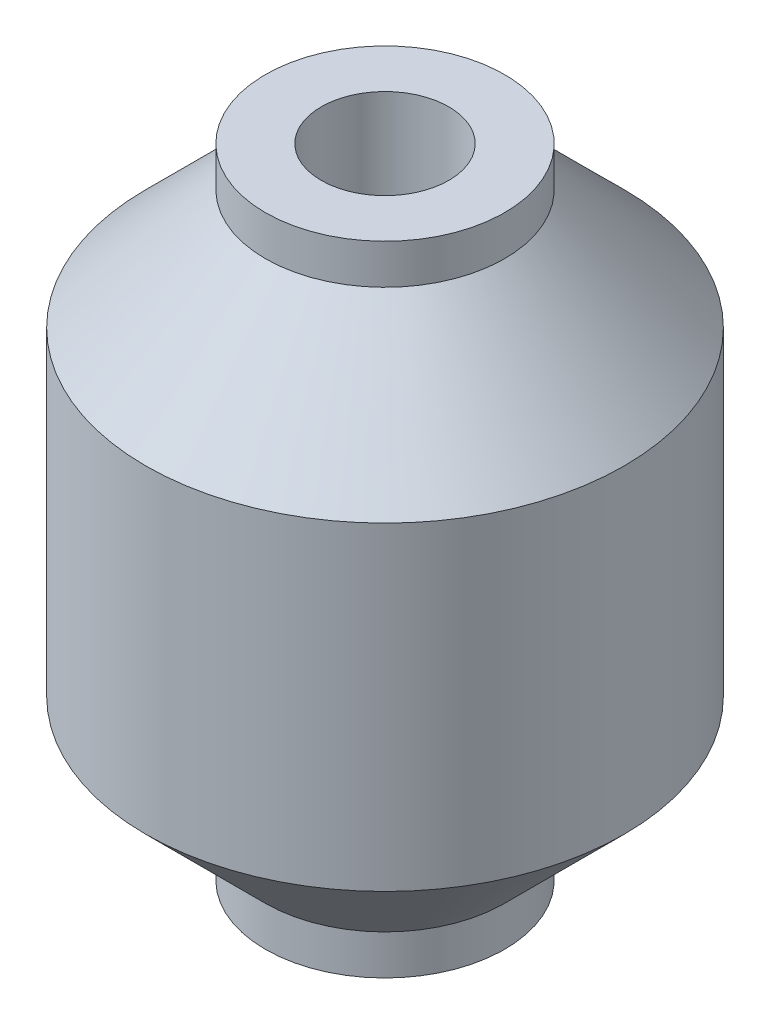
ISO-10303-21;
HEADER;
FILE_DESCRIPTION(('STEP AP214'),'2;1');
FILE_NAME('part.step','',(''),(''),'','','');
FILE_SCHEMA(('AUTOMOTIVE_DESIGN { 1 0 10303 214 1 1 1 1 }'));
ENDSEC;
DATA;
#1=APPLICATION_CONTEXT('core data for automotive mechanical design processes');
#2=APPLICATION_PROTOCOL_DEFINITION('international standard','automotive_design',2000,#1);
#3=PRODUCT_CONTEXT('',#1,'mechanical');
#4=PRODUCT('Part','Part','',(#3));
#5=PRODUCT_RELATED_PRODUCT_CATEGORY('part','',(#4));
#6=PRODUCT_DEFINITION_FORMATION('','',#4);
#7=PRODUCT_DEFINITION_CONTEXT('part definition',#1,'design');
#8=PRODUCT_DEFINITION('design','',#6,#7);
#9=PRODUCT_DEFINITION_SHAPE('','',#8);
#10=(LENGTH_UNIT() NAMED_UNIT(*) SI_UNIT(.MILLI.,.METRE.));
#11=(NAMED_UNIT(*) PLANE_ANGLE_UNIT() SI_UNIT($,.RADIAN.));
#12=(NAMED_UNIT(*) SI_UNIT($,.STERADIAN.) SOLID_ANGLE_UNIT());
#13=UNCERTAINTY_MEASURE_WITH_UNIT(LENGTH_MEASURE(1.E-05),#10,'distance_accuracy_value','');
#14=(GEOMETRIC_REPRESENTATION_CONTEXT(3) GLOBAL_UNCERTAINTY_ASSIGNED_CONTEXT((#13)) GLOBAL_UNIT_ASSIGNED_CONTEXT((#10,
#11,#12)) REPRESENTATION_CONTEXT('',''));
#15=CARTESIAN_POINT('',(0.,0.,0.));
#16=DIRECTION('',(0.,0.,1.));
#17=DIRECTION('',(1.,0.,0.));
#18=AXIS2_PLACEMENT_3D('',#15,#16,#17);
#19=CARTESIAN_POINT('',(0.,4.,0.));
#20=DIRECTION('',(0.,-1.,0.));
#21=DIRECTION('',(0.,0.,-1.));
#22=AXIS2_PLACEMENT_3D('',#19,#20,#21);
#23=CYLINDRICAL_SURFACE('',#22,6.);
#24=CARTESIAN_POINT('',(0.,4.,0.));
#25=DIRECTION('',(0.,1.,0.));
#26=DIRECTION('',(0.,0.,1.));
#27=AXIS2_PLACEMENT_3D('',#24,#25,#26);
#28=CIRCLE('',#27,6.);
#29=CARTESIAN_POINT('',(0.,4.,6.));
#30=VERTEX_POINT('',#29);
#31=EDGE_CURVE('E57',#30,#30,#28,.T.);
#32=ORIENTED_EDGE('',*,*,#31,.F.);
#33=EDGE_LOOP('',(#32));
#34=FACE_BOUND('',#33,.T.);
#35=CARTESIAN_POINT('',(0.,-4.,0.));
#36=DIRECTION('',(0.,1.,0.));
#37=DIRECTION('',(0.,0.,1.));
#38=AXIS2_PLACEMENT_3D('',#35,#36,#37);
#39=CIRCLE('',#38,6.);
#40=CARTESIAN_POINT('',(0.,-4.,6.));
#41=VERTEX_POINT('',#40);
#42=EDGE_CURVE('E62',#41,#41,#39,.T.);
#43=ORIENTED_EDGE('',*,*,#42,.T.);
#44=EDGE_LOOP('',(#43));
#45=FACE_BOUND('',#44,.T.);
#46=ADVANCED_FACE('F43',(#34,#45),#23,.T.);
#47=CARTESIAN_POINT('',(0.,8.,0.));
#48=DIRECTION('',(0.,-1.,0.));
#49=DIRECTION('',(0.,0.,-1.));
#50=AXIS2_PLACEMENT_3D('',#47,#48,#49);
#51=CYLINDRICAL_SURFACE('',#50,3.);
#52=CARTESIAN_POINT('',(0.,7.00000000000003,0.));
#53=DIRECTION('',(0.,1.,0.));
#54=DIRECTION('',(0.,0.,1.));
#55=AXIS2_PLACEMENT_3D('',#52,#53,#54);
#56=CIRCLE('',#55,3.);
#57=CARTESIAN_POINT('',(0.,7.00000000000003,3.));
#58=VERTEX_POINT('',#57);
#59=EDGE_CURVE('E52',#58,#58,#56,.T.);
#60=ORIENTED_EDGE('',*,*,#59,.T.);
#61=EDGE_LOOP('',(#60));
#62=FACE_BOUND('',#61,.T.);
#63=CARTESIAN_POINT('',(0.,8.,0.));
#64=DIRECTION('',(0.,1.,0.));
#65=DIRECTION('',(0.,0.,1.));
#66=AXIS2_PLACEMENT_3D('',#63,#64,#65);
#67=CIRCLE('',#66,3.);
#68=CARTESIAN_POINT('',(0.,8.,3.));
#69=VERTEX_POINT('',#68);
#70=EDGE_CURVE('E67',#69,#69,#67,.T.);
#71=ORIENTED_EDGE('',*,*,#70,.F.);
#72=EDGE_LOOP('',(#71));
#73=FACE_BOUND('',#72,.T.);
#74=ADVANCED_FACE('F92',(#62,#73),#51,.T.);
#75=CARTESIAN_POINT('',(0.,8.,0.));
#76=DIRECTION('',(0.,1.,0.));
#77=DIRECTION('',(0.,0.,1.));
#78=AXIS2_PLACEMENT_3D('',#75,#76,#77);
#79=PLANE('',#78);
#80=CARTESIAN_POINT('',(0.,8.,0.));
#81=DIRECTION('',(0.,1.,0.));
#82=DIRECTION('',(0.,0.,1.));
#83=AXIS2_PLACEMENT_3D('',#80,#81,#82);
#84=CIRCLE('',#83,1.6);
#85=CARTESIAN_POINT('',(0.,8.,1.6));
#86=VERTEX_POINT('',#85);
#87=EDGE_CURVE('E80',#86,#86,#84,.T.);
#88=ORIENTED_EDGE('',*,*,#87,.F.);
#89=EDGE_LOOP('',(#88));
#90=FACE_BOUND('',#89,.T.);
#91=ORIENTED_EDGE('',*,*,#70,.T.);
#92=EDGE_LOOP('',(#91));
#93=FACE_BOUND('',#92,.T.);
#94=ADVANCED_FACE('F88',(#90,#93),#79,.T.);
#95=CARTESIAN_POINT('',(0.,-8.,0.));
#96=DIRECTION('',(0.,1.,0.));
#97=DIRECTION('',(0.,0.,1.));
#98=AXIS2_PLACEMENT_3D('',#95,#96,#97);
#99=CYLINDRICAL_SURFACE('',#98,3.);
#100=CARTESIAN_POINT('',(0.,-6.99999999999999,0.));
#101=DIRECTION('',(0.,1.,0.));
#102=DIRECTION('',(0.,0.,1.));
#103=AXIS2_PLACEMENT_3D('',#100,#101,#102);
#104=CIRCLE('',#103,3.);
#105=CARTESIAN_POINT('',(0.,-6.99999999999999,3.));
#106=VERTEX_POINT('',#105);
#107=EDGE_CURVE('E10',#106,#106,#104,.F.);
#108=ORIENTED_EDGE('',*,*,#107,.T.);
#109=EDGE_LOOP('',(#108));
#110=FACE_BOUND('',#109,.T.);
#111=CARTESIAN_POINT('',(0.,-8.,0.));
#112=DIRECTION('',(0.,1.,0.));
#113=DIRECTION('',(0.,0.,1.));
#114=AXIS2_PLACEMENT_3D('',#111,#112,#113);
#115=CIRCLE('',#114,3.);
#116=CARTESIAN_POINT('',(0.,-8.,3.));
#117=VERTEX_POINT('',#116);
#118=EDGE_CURVE('E72',#117,#117,#115,.T.);
#119=ORIENTED_EDGE('',*,*,#118,.T.);
#120=EDGE_LOOP('',(#119));
#121=FACE_BOUND('',#120,.T.);
#122=ADVANCED_FACE('F91',(#110,#121),#99,.T.);
#123=CARTESIAN_POINT('',(0.,-8.,0.));
#124=DIRECTION('',(0.,-1.,0.));
#125=DIRECTION('',(0.,0.,1.));
#126=AXIS2_PLACEMENT_3D('',#123,#124,#125);
#127=PLANE('',#126);
#128=CARTESIAN_POINT('',(0.,-8.,0.));
#129=DIRECTION('',(0.,-1.,0.));
#130=DIRECTION('',(0.,0.,-1.));
#131=AXIS2_PLACEMENT_3D('',#128,#129,#130);
#132=CIRCLE('',#131,1.6);
#133=CARTESIAN_POINT('',(0.,-8.,-1.6));
#134=VERTEX_POINT('',#133);
#135=EDGE_CURVE('E76',#134,#134,#132,.F.);
#136=ORIENTED_EDGE('',*,*,#135,.T.);
#137=EDGE_LOOP('',(#136));
#138=FACE_BOUND('',#137,.T.);
#139=ORIENTED_EDGE('',*,*,#118,.F.);
#140=EDGE_LOOP('',(#139));
#141=FACE_BOUND('',#140,.T.);
#142=ADVANCED_FACE('F115',(#138,#141),#127,.T.);
#143=CARTESIAN_POINT('',(0.,-12.5254833995939,0.));
#144=DIRECTION('',(0.,1.,0.));
#145=DIRECTION('',(0.,0.,1.));
#146=AXIS2_PLACEMENT_3D('',#143,#144,#145);
#147=CYLINDRICAL_SURFACE('',#146,1.6);
#148=ORIENTED_EDGE('',*,*,#87,.T.);
#149=EDGE_LOOP('',(#148));
#150=FACE_BOUND('',#149,.T.);
#151=ORIENTED_EDGE('',*,*,#135,.F.);
#152=EDGE_LOOP('',(#151));
#153=FACE_BOUND('',#152,.T.);
#154=ADVANCED_FACE('F85',(#150,#153),#147,.F.);
#155=CARTESIAN_POINT('',(0.,7.00000000000003,0.));
#156=DIRECTION('',(0.,-1.,0.));
#157=DIRECTION('',(0.,0.,-1.));
#158=AXIS2_PLACEMENT_3D('',#155,#156,#157);
#159=CONICAL_SURFACE('',#158,3.,0.785398163397443);
#160=ORIENTED_EDGE('',*,*,#31,.T.);
#161=EDGE_LOOP('',(#160));
#162=FACE_BOUND('',#161,.T.);
#163=ORIENTED_EDGE('',*,*,#59,.F.);
#164=EDGE_LOOP('',(#163));
#165=FACE_BOUND('',#164,.T.);
#166=ADVANCED_FACE('F105',(#162,#165),#159,.T.);
#167=CARTESIAN_POINT('',(0.,-4.,0.));
#168=DIRECTION('',(0.,1.,0.));
#169=DIRECTION('',(0.,0.,1.));
#170=AXIS2_PLACEMENT_3D('',#167,#168,#169);
#171=CONICAL_SURFACE('',#170,6.00000000000002,0.785398163397453);
#172=ORIENTED_EDGE('',*,*,#107,.F.);
#173=EDGE_LOOP('',(#172));
#174=FACE_BOUND('',#173,.T.);
#175=ORIENTED_EDGE('',*,*,#42,.F.);
#176=EDGE_LOOP('',(#175));
#177=FACE_BOUND('',#176,.T.);
#178=ADVANCED_FACE('F46',(#174,#177),#171,.T.);
#179=CLOSED_SHELL('',(#46,#74,#94,#122,#142,#154,#166,#178));
#180=MANIFOLD_SOLID_BREP('B2',#179);
#181=ADVANCED_BREP_SHAPE_REPRESENTATION('',(#18,#180),#14);
#182=SHAPE_DEFINITION_REPRESENTATION(#9,#181);
ENDSEC;
END-ISO-10303-21;
